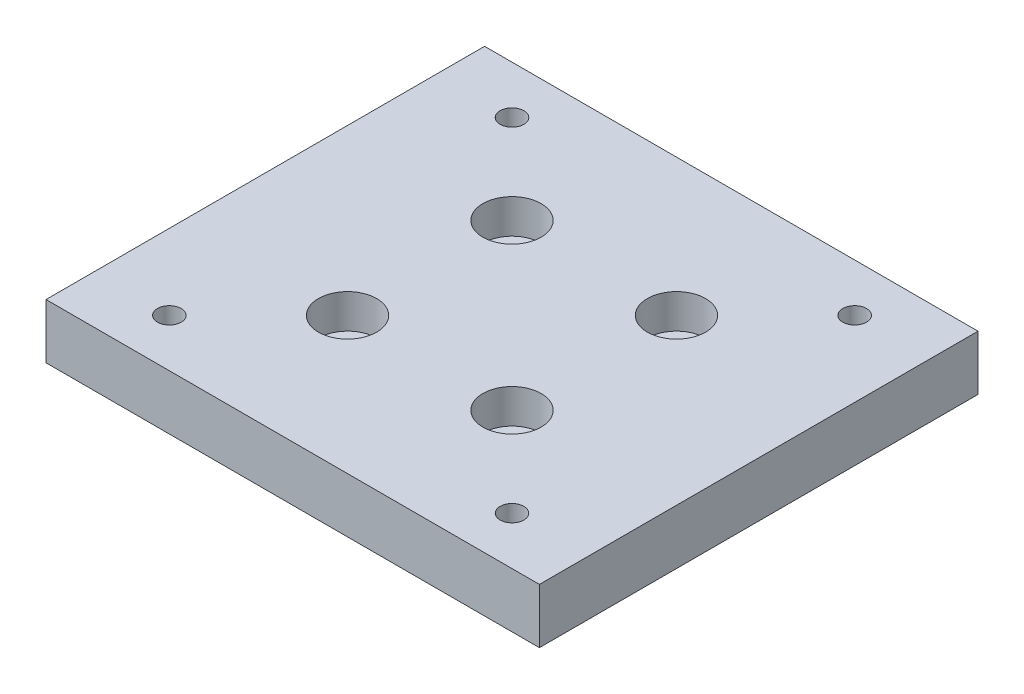
ISO-10303-21;
HEADER;
FILE_DESCRIPTION(('STEP AP214'),'2;1');
FILE_NAME('part.step','',(''),(''),'','','');
FILE_SCHEMA(('AUTOMOTIVE_DESIGN { 1 0 10303 214 1 1 1 1 }'));
ENDSEC;
DATA;
#1=APPLICATION_CONTEXT('core data for automotive mechanical design processes');
#2=APPLICATION_PROTOCOL_DEFINITION('international standard','automotive_design',2000,#1);
#3=PRODUCT_CONTEXT('',#1,'mechanical');
#4=PRODUCT('Part','Part','',(#3));
#5=PRODUCT_RELATED_PRODUCT_CATEGORY('part','',(#4));
#6=PRODUCT_DEFINITION_FORMATION('','',#4);
#7=PRODUCT_DEFINITION_CONTEXT('part definition',#1,'design');
#8=PRODUCT_DEFINITION('design','',#6,#7);
#9=PRODUCT_DEFINITION_SHAPE('','',#8);
#10=(LENGTH_UNIT() NAMED_UNIT(*) SI_UNIT(.MILLI.,.METRE.));
#11=(NAMED_UNIT(*) PLANE_ANGLE_UNIT() SI_UNIT($,.RADIAN.));
#12=(NAMED_UNIT(*) SI_UNIT($,.STERADIAN.) SOLID_ANGLE_UNIT());
#13=UNCERTAINTY_MEASURE_WITH_UNIT(LENGTH_MEASURE(1.E-05),#10,'distance_accuracy_value','');
#14=(GEOMETRIC_REPRESENTATION_CONTEXT(3) GLOBAL_UNCERTAINTY_ASSIGNED_CONTEXT((#13)) GLOBAL_UNIT_ASSIGNED_CONTEXT((#10,
#11,#12)) REPRESENTATION_CONTEXT('',''));
#15=CARTESIAN_POINT('',(0.,0.,0.));
#16=DIRECTION('',(0.,0.,1.));
#17=DIRECTION('',(1.,0.,0.));
#18=AXIS2_PLACEMENT_3D('',#15,#16,#17);
#19=CARTESIAN_POINT('',(0.,12.7,0.));
#20=DIRECTION('',(0.,-1.,0.));
#21=DIRECTION('',(0.,0.,-1.));
#22=AXIS2_PLACEMENT_3D('',#19,#20,#21);
#23=PLANE('',#22);
#24=CARTESIAN_POINT('',(17.4625,12.7,-11.1125));
#25=DIRECTION('',(0.,1.,0.));
#26=DIRECTION('',(0.,0.,1.));
#27=AXIS2_PLACEMENT_3D('',#24,#25,#26);
#28=CIRCLE('',#27,2.75);
#29=CARTESIAN_POINT('',(17.4625,12.7,-8.3625));
#30=VERTEX_POINT('',#29);
#31=EDGE_CURVE('E180',#30,#30,#28,.T.);
#32=ORIENTED_EDGE('',*,*,#31,.F.);
#33=EDGE_LOOP('',(#32));
#34=FACE_BOUND('',#33,.T.);
#35=CARTESIAN_POINT('',(96.8375,12.7,-90.4875));
#36=DIRECTION('',(0.,1.,0.));
#37=DIRECTION('',(0.,0.,1.));
#38=AXIS2_PLACEMENT_3D('',#35,#36,#37);
#39=CIRCLE('',#38,2.75);
#40=CARTESIAN_POINT('',(96.8375,12.7,-87.7375));
#41=VERTEX_POINT('',#40);
#42=EDGE_CURVE('E168',#41,#41,#39,.T.);
#43=ORIENTED_EDGE('',*,*,#42,.F.);
#44=EDGE_LOOP('',(#43));
#45=FACE_BOUND('',#44,.T.);
#46=CARTESIAN_POINT('',(17.4625,12.7,-90.4875));
#47=DIRECTION('',(0.,1.,0.));
#48=DIRECTION('',(0.,0.,1.));
#49=AXIS2_PLACEMENT_3D('',#46,#47,#48);
#50=CIRCLE('',#49,2.75);
#51=CARTESIAN_POINT('',(17.4625,12.7,-87.7375));
#52=VERTEX_POINT('',#51);
#53=EDGE_CURVE('E162',#52,#52,#50,.T.);
#54=ORIENTED_EDGE('',*,*,#53,.F.);
#55=EDGE_LOOP('',(#54));
#56=FACE_BOUND('',#55,.T.);
#57=CARTESIAN_POINT('',(38.1,12.7,-69.85));
#58=DIRECTION('',(0.,1.,0.));
#59=DIRECTION('',(0.,0.,1.));
#60=AXIS2_PLACEMENT_3D('',#57,#58,#59);
#61=CIRCLE('',#60,6.74751);
#62=CARTESIAN_POINT('',(38.1,12.7,-63.10249));
#63=VERTEX_POINT('',#62);
#64=EDGE_CURVE('E156',#63,#63,#61,.T.);
#65=ORIENTED_EDGE('',*,*,#64,.F.);
#66=EDGE_LOOP('',(#65));
#67=FACE_BOUND('',#66,.T.);
#68=CARTESIAN_POINT('',(76.2,12.7,-69.85));
#69=DIRECTION('',(0.,1.,0.));
#70=DIRECTION('',(0.,0.,1.));
#71=AXIS2_PLACEMENT_3D('',#68,#69,#70);
#72=CIRCLE('',#71,6.74751);
#73=CARTESIAN_POINT('',(76.2,12.7,-63.10249));
#74=VERTEX_POINT('',#73);
#75=EDGE_CURVE('E144',#74,#74,#72,.T.);
#76=ORIENTED_EDGE('',*,*,#75,.F.);
#77=EDGE_LOOP('',(#76));
#78=FACE_BOUND('',#77,.T.);
#79=CARTESIAN_POINT('',(76.2,12.7,-31.75));
#80=DIRECTION('',(0.,1.,0.));
#81=DIRECTION('',(0.,0.,1.));
#82=AXIS2_PLACEMENT_3D('',#79,#80,#81);
#83=CIRCLE('',#82,6.74751);
#84=CARTESIAN_POINT('',(76.2,12.7,-25.00249));
#85=VERTEX_POINT('',#84);
#86=EDGE_CURVE('E132',#85,#85,#83,.T.);
#87=ORIENTED_EDGE('',*,*,#86,.F.);
#88=EDGE_LOOP('',(#87));
#89=FACE_BOUND('',#88,.T.);
#90=CARTESIAN_POINT('',(38.1,12.7,-31.75));
#91=DIRECTION('',(0.,1.,0.));
#92=DIRECTION('',(0.,0.,1.));
#93=AXIS2_PLACEMENT_3D('',#90,#91,#92);
#94=CIRCLE('',#93,6.74751);
#95=CARTESIAN_POINT('',(38.1,12.7,-25.00249));
#96=VERTEX_POINT('',#95);
#97=EDGE_CURVE('E120',#96,#96,#94,.T.);
#98=ORIENTED_EDGE('',*,*,#97,.F.);
#99=EDGE_LOOP('',(#98));
#100=FACE_BOUND('',#99,.T.);
#101=DIRECTION('',(0.,0.,1.));
#102=VECTOR('',#101,1.);
#103=CARTESIAN_POINT('',(0.,12.7,0.));
#104=LINE('',#103,#102);
#105=CARTESIAN_POINT('',(0.,12.7,-101.6));
#106=VERTEX_POINT('',#105);
#107=CARTESIAN_POINT('',(0.,12.7,0.));
#108=VERTEX_POINT('',#107);
#109=EDGE_CURVE('E85',#106,#108,#104,.T.);
#110=ORIENTED_EDGE('',*,*,#109,.T.);
#111=DIRECTION('',(1.,0.,0.));
#112=VECTOR('',#111,1.);
#113=CARTESIAN_POINT('',(0.,12.7,0.));
#114=LINE('',#113,#112);
#115=CARTESIAN_POINT('',(114.3,12.7,0.));
#116=VERTEX_POINT('',#115);
#117=EDGE_CURVE('E80',#108,#116,#114,.T.);
#118=ORIENTED_EDGE('',*,*,#117,.T.);
#119=DIRECTION('',(0.,0.,-1.));
#120=VECTOR('',#119,1.);
#121=CARTESIAN_POINT('',(114.3,12.7,0.));
#122=LINE('',#121,#120);
#123=CARTESIAN_POINT('',(114.3,12.7,-101.6));
#124=VERTEX_POINT('',#123);
#125=EDGE_CURVE('E83',#116,#124,#122,.T.);
#126=ORIENTED_EDGE('',*,*,#125,.T.);
#127=DIRECTION('',(-1.,0.,0.));
#128=VECTOR('',#127,1.);
#129=CARTESIAN_POINT('',(0.,12.7,-101.6));
#130=LINE('',#129,#128);
#131=EDGE_CURVE('E50',#124,#106,#130,.T.);
#132=ORIENTED_EDGE('',*,*,#131,.T.);
#133=EDGE_LOOP('',(#110,#118,#126,#132));
#134=FACE_BOUND('',#133,.T.);
#135=CARTESIAN_POINT('',(96.8375,12.7,-11.1125));
#136=DIRECTION('',(0.,1.,0.));
#137=DIRECTION('',(0.,0.,1.));
#138=AXIS2_PLACEMENT_3D('',#135,#136,#137);
#139=CIRCLE('',#138,2.75);
#140=CARTESIAN_POINT('',(96.8375,12.7,-8.3625));
#141=VERTEX_POINT('',#140);
#142=EDGE_CURVE('E174',#141,#141,#139,.T.);
#143=ORIENTED_EDGE('',*,*,#142,.F.);
#144=EDGE_LOOP('',(#143));
#145=FACE_BOUND('',#144,.T.);
#146=ADVANCED_FACE('F33',(#34,#45,#56,#67,#78,#89,#100,#134,#145),#23,.F.);
#147=CARTESIAN_POINT('',(0.,0.,0.));
#148=DIRECTION('',(0.,-1.,0.));
#149=DIRECTION('',(0.,0.,-1.));
#150=AXIS2_PLACEMENT_3D('',#147,#148,#149);
#151=PLANE('',#150);
#152=CARTESIAN_POINT('',(17.4625,0.,-11.1125));
#153=DIRECTION('',(0.,1.,0.));
#154=DIRECTION('',(0.,0.,1.));
#155=AXIS2_PLACEMENT_3D('',#152,#153,#154);
#156=CIRCLE('',#155,2.75);
#157=CARTESIAN_POINT('',(17.4625,0.,-8.3625));
#158=VERTEX_POINT('',#157);
#159=EDGE_CURVE('E177',#158,#158,#156,.T.);
#160=ORIENTED_EDGE('',*,*,#159,.T.);
#161=EDGE_LOOP('',(#160));
#162=FACE_BOUND('',#161,.T.);
#163=CARTESIAN_POINT('',(96.8375,0.,-11.1125));
#164=DIRECTION('',(0.,1.,0.));
#165=DIRECTION('',(0.,0.,1.));
#166=AXIS2_PLACEMENT_3D('',#163,#164,#165);
#167=CIRCLE('',#166,2.74999999999999);
#168=CARTESIAN_POINT('',(96.8375,0.,-8.36250000000001));
#169=VERTEX_POINT('',#168);
#170=EDGE_CURVE('E171',#169,#169,#167,.T.);
#171=ORIENTED_EDGE('',*,*,#170,.T.);
#172=EDGE_LOOP('',(#171));
#173=FACE_BOUND('',#172,.T.);
#174=CARTESIAN_POINT('',(96.8375,0.,-90.4875));
#175=DIRECTION('',(0.,1.,0.));
#176=DIRECTION('',(0.,0.,1.));
#177=AXIS2_PLACEMENT_3D('',#174,#175,#176);
#178=CIRCLE('',#177,2.74999999999999);
#179=CARTESIAN_POINT('',(96.8375,0.,-87.7375));
#180=VERTEX_POINT('',#179);
#181=EDGE_CURVE('E165',#180,#180,#178,.T.);
#182=ORIENTED_EDGE('',*,*,#181,.T.);
#183=EDGE_LOOP('',(#182));
#184=FACE_BOUND('',#183,.T.);
#185=CARTESIAN_POINT('',(17.4625,0.,-90.4875));
#186=DIRECTION('',(0.,1.,0.));
#187=DIRECTION('',(0.,0.,1.));
#188=AXIS2_PLACEMENT_3D('',#185,#186,#187);
#189=CIRCLE('',#188,2.75);
#190=CARTESIAN_POINT('',(17.4625,0.,-87.7375));
#191=VERTEX_POINT('',#190);
#192=EDGE_CURVE('E159',#191,#191,#189,.T.);
#193=ORIENTED_EDGE('',*,*,#192,.T.);
#194=EDGE_LOOP('',(#193));
#195=FACE_BOUND('',#194,.T.);
#196=CARTESIAN_POINT('',(38.1,0.,-69.85));
#197=DIRECTION('',(0.,1.,0.));
#198=DIRECTION('',(0.,0.,1.));
#199=AXIS2_PLACEMENT_3D('',#196,#197,#198);
#200=CIRCLE('',#199,4.21639999999999);
#201=CARTESIAN_POINT('',(38.1,0.,-65.6336));
#202=VERTEX_POINT('',#201);
#203=EDGE_CURVE('E147',#202,#202,#200,.T.);
#204=ORIENTED_EDGE('',*,*,#203,.T.);
#205=EDGE_LOOP('',(#204));
#206=FACE_BOUND('',#205,.T.);
#207=DIRECTION('',(0.,0.,1.));
#208=VECTOR('',#207,1.);
#209=CARTESIAN_POINT('',(0.,0.,0.));
#210=LINE('',#209,#208);
#211=CARTESIAN_POINT('',(0.,0.,-101.6));
#212=VERTEX_POINT('',#211);
#213=CARTESIAN_POINT('',(0.,0.,0.));
#214=VERTEX_POINT('',#213);
#215=EDGE_CURVE('E97',#212,#214,#210,.T.);
#216=ORIENTED_EDGE('',*,*,#215,.F.);
#217=DIRECTION('',(-1.,0.,0.));
#218=VECTOR('',#217,1.);
#219=CARTESIAN_POINT('',(0.,0.,-101.6));
#220=LINE('',#219,#218);
#221=CARTESIAN_POINT('',(114.3,0.,-101.6));
#222=VERTEX_POINT('',#221);
#223=EDGE_CURVE('E73',#222,#212,#220,.T.);
#224=ORIENTED_EDGE('',*,*,#223,.F.);
#225=DIRECTION('',(0.,0.,-1.));
#226=VECTOR('',#225,1.);
#227=CARTESIAN_POINT('',(114.3,0.,0.));
#228=LINE('',#227,#226);
#229=CARTESIAN_POINT('',(114.3,0.,0.));
#230=VERTEX_POINT('',#229);
#231=EDGE_CURVE('E67',#230,#222,#228,.T.);
#232=ORIENTED_EDGE('',*,*,#231,.F.);
#233=DIRECTION('',(1.,0.,0.));
#234=VECTOR('',#233,1.);
#235=CARTESIAN_POINT('',(0.,0.,0.));
#236=LINE('',#235,#234);
#237=EDGE_CURVE('E89',#214,#230,#236,.T.);
#238=ORIENTED_EDGE('',*,*,#237,.F.);
#239=EDGE_LOOP('',(#216,#224,#232,#238));
#240=FACE_BOUND('',#239,.T.);
#241=CARTESIAN_POINT('',(38.1,0.,-31.75));
#242=DIRECTION('',(0.,1.,0.));
#243=DIRECTION('',(0.,0.,1.));
#244=AXIS2_PLACEMENT_3D('',#241,#242,#243);
#245=CIRCLE('',#244,4.21639999999999);
#246=CARTESIAN_POINT('',(38.1,0.,-27.5336));
#247=VERTEX_POINT('',#246);
#248=EDGE_CURVE('E100',#247,#247,#245,.T.);
#249=ORIENTED_EDGE('',*,*,#248,.T.);
#250=EDGE_LOOP('',(#249));
#251=FACE_BOUND('',#250,.T.);
#252=CARTESIAN_POINT('',(76.2,0.,-31.75));
#253=DIRECTION('',(0.,1.,0.));
#254=DIRECTION('',(0.,0.,1.));
#255=AXIS2_PLACEMENT_3D('',#252,#253,#254);
#256=CIRCLE('',#255,4.21639999999999);
#257=CARTESIAN_POINT('',(76.2,0.,-27.5336));
#258=VERTEX_POINT('',#257);
#259=EDGE_CURVE('E123',#258,#258,#256,.T.);
#260=ORIENTED_EDGE('',*,*,#259,.T.);
#261=EDGE_LOOP('',(#260));
#262=FACE_BOUND('',#261,.T.);
#263=CARTESIAN_POINT('',(76.2,0.,-69.85));
#264=DIRECTION('',(0.,1.,0.));
#265=DIRECTION('',(0.,0.,1.));
#266=AXIS2_PLACEMENT_3D('',#263,#264,#265);
#267=CIRCLE('',#266,4.21639999999999);
#268=CARTESIAN_POINT('',(76.2,0.,-65.6336));
#269=VERTEX_POINT('',#268);
#270=EDGE_CURVE('E135',#269,#269,#267,.T.);
#271=ORIENTED_EDGE('',*,*,#270,.T.);
#272=EDGE_LOOP('',(#271));
#273=FACE_BOUND('',#272,.T.);
#274=ADVANCED_FACE('F108',(#162,#173,#184,#195,#206,#240,#251,#262,#273),#151,.T.);
#275=CARTESIAN_POINT('',(0.,12.7,0.));
#276=DIRECTION('',(1.,0.,0.));
#277=DIRECTION('',(0.,0.,-1.));
#278=AXIS2_PLACEMENT_3D('',#275,#276,#277);
#279=PLANE('',#278);
#280=ORIENTED_EDGE('',*,*,#215,.T.);
#281=DIRECTION('',(0.,-1.,0.));
#282=VECTOR('',#281,1.);
#283=CARTESIAN_POINT('',(0.,12.7,0.));
#284=LINE('',#283,#282);
#285=EDGE_CURVE('E11',#108,#214,#284,.T.);
#286=ORIENTED_EDGE('',*,*,#285,.F.);
#287=ORIENTED_EDGE('',*,*,#109,.F.);
#288=DIRECTION('',(0.,-1.,0.));
#289=VECTOR('',#288,1.);
#290=CARTESIAN_POINT('',(0.,12.7,-101.6));
#291=LINE('',#290,#289);
#292=EDGE_CURVE('E93',#106,#212,#291,.T.);
#293=ORIENTED_EDGE('',*,*,#292,.T.);
#294=EDGE_LOOP('',(#280,#286,#287,#293));
#295=FACE_BOUND('',#294,.T.);
#296=ADVANCED_FACE('F35',(#295),#279,.F.);
#297=CARTESIAN_POINT('',(0.,12.7,0.));
#298=DIRECTION('',(0.,0.,-1.));
#299=DIRECTION('',(-1.,0.,0.));
#300=AXIS2_PLACEMENT_3D('',#297,#298,#299);
#301=PLANE('',#300);
#302=ORIENTED_EDGE('',*,*,#237,.T.);
#303=DIRECTION('',(0.,-1.,0.));
#304=VECTOR('',#303,1.);
#305=CARTESIAN_POINT('',(114.3,12.7,0.));
#306=LINE('',#305,#304);
#307=EDGE_CURVE('E42',#116,#230,#306,.T.);
#308=ORIENTED_EDGE('',*,*,#307,.F.);
#309=ORIENTED_EDGE('',*,*,#117,.F.);
#310=ORIENTED_EDGE('',*,*,#285,.T.);
#311=EDGE_LOOP('',(#302,#308,#309,#310));
#312=FACE_BOUND('',#311,.T.);
#313=ADVANCED_FACE('F88',(#312),#301,.F.);
#314=CARTESIAN_POINT('',(114.3,12.7,0.));
#315=DIRECTION('',(-1.,0.,0.));
#316=DIRECTION('',(0.,0.,1.));
#317=AXIS2_PLACEMENT_3D('',#314,#315,#316);
#318=PLANE('',#317);
#319=ORIENTED_EDGE('',*,*,#231,.T.);
#320=DIRECTION('',(0.,-1.,0.));
#321=VECTOR('',#320,1.);
#322=CARTESIAN_POINT('',(114.3,12.7,-101.6));
#323=LINE('',#322,#321);
#324=EDGE_CURVE('E90',#124,#222,#323,.T.);
#325=ORIENTED_EDGE('',*,*,#324,.F.);
#326=ORIENTED_EDGE('',*,*,#125,.F.);
#327=ORIENTED_EDGE('',*,*,#307,.T.);
#328=EDGE_LOOP('',(#319,#325,#326,#327));
#329=FACE_BOUND('',#328,.T.);
#330=ADVANCED_FACE('F91',(#329),#318,.F.);
#331=CARTESIAN_POINT('',(0.,12.7,-101.6));
#332=DIRECTION('',(0.,0.,1.));
#333=DIRECTION('',(1.,0.,0.));
#334=AXIS2_PLACEMENT_3D('',#331,#332,#333);
#335=PLANE('',#334);
#336=ORIENTED_EDGE('',*,*,#223,.T.);
#337=ORIENTED_EDGE('',*,*,#292,.F.);
#338=ORIENTED_EDGE('',*,*,#131,.F.);
#339=ORIENTED_EDGE('',*,*,#324,.T.);
#340=EDGE_LOOP('',(#336,#337,#338,#339));
#341=FACE_BOUND('',#340,.T.);
#342=ADVANCED_FACE('F105',(#341),#335,.F.);
#343=CARTESIAN_POINT('',(38.1,12.7,-31.75));
#344=DIRECTION('',(0.,1.,0.));
#345=DIRECTION('',(0.,0.,1.));
#346=AXIS2_PLACEMENT_3D('',#343,#344,#345);
#347=CYLINDRICAL_SURFACE('',#346,4.2164);
#348=ORIENTED_EDGE('',*,*,#248,.F.);
#349=EDGE_LOOP('',(#348));
#350=FACE_BOUND('',#349,.T.);
#351=CARTESIAN_POINT('',(38.1,4.7625,-31.75));
#352=DIRECTION('',(0.,1.,0.));
#353=DIRECTION('',(0.,0.,1.));
#354=AXIS2_PLACEMENT_3D('',#351,#352,#353);
#355=CIRCLE('',#354,4.2164);
#356=CARTESIAN_POINT('',(38.1,4.7625,-27.5336));
#357=VERTEX_POINT('',#356);
#358=EDGE_CURVE('E114',#357,#357,#355,.T.);
#359=ORIENTED_EDGE('',*,*,#358,.T.);
#360=EDGE_LOOP('',(#359));
#361=FACE_BOUND('',#360,.T.);
#362=ADVANCED_FACE('F214',(#350,#361),#347,.F.);
#363=CARTESIAN_POINT('',(42.3164,4.7625,-31.75));
#364=DIRECTION('',(0.,-1.,0.));
#365=DIRECTION('',(0.,0.,-1.));
#366=AXIS2_PLACEMENT_3D('',#363,#364,#365);
#367=PLANE('',#366);
#368=ORIENTED_EDGE('',*,*,#358,.F.);
#369=EDGE_LOOP('',(#368));
#370=FACE_BOUND('',#369,.T.);
#371=CARTESIAN_POINT('',(38.1,4.7625,-31.75));
#372=DIRECTION('',(0.,1.,0.));
#373=DIRECTION('',(0.,0.,1.));
#374=AXIS2_PLACEMENT_3D('',#371,#372,#373);
#375=CIRCLE('',#374,6.74751);
#376=CARTESIAN_POINT('',(38.1,4.7625,-25.00249));
#377=VERTEX_POINT('',#376);
#378=EDGE_CURVE('E117',#377,#377,#375,.T.);
#379=ORIENTED_EDGE('',*,*,#378,.T.);
#380=EDGE_LOOP('',(#379));
#381=FACE_BOUND('',#380,.T.);
#382=ADVANCED_FACE('F204',(#370,#381),#367,.F.);
#383=CARTESIAN_POINT('',(38.1,12.7,-31.75));
#384=DIRECTION('',(0.,1.,0.));
#385=DIRECTION('',(0.,0.,1.));
#386=AXIS2_PLACEMENT_3D('',#383,#384,#385);
#387=CYLINDRICAL_SURFACE('',#386,6.74751);
#388=ORIENTED_EDGE('',*,*,#378,.F.);
#389=EDGE_LOOP('',(#388));
#390=FACE_BOUND('',#389,.T.);
#391=ORIENTED_EDGE('',*,*,#97,.T.);
#392=EDGE_LOOP('',(#391));
#393=FACE_BOUND('',#392,.T.);
#394=ADVANCED_FACE('F201',(#390,#393),#387,.F.);
#395=CARTESIAN_POINT('',(76.2,12.7,-31.75));
#396=DIRECTION('',(0.,1.,0.));
#397=DIRECTION('',(0.,0.,1.));
#398=AXIS2_PLACEMENT_3D('',#395,#396,#397);
#399=CYLINDRICAL_SURFACE('',#398,4.21639999999999);
#400=ORIENTED_EDGE('',*,*,#259,.F.);
#401=EDGE_LOOP('',(#400));
#402=FACE_BOUND('',#401,.T.);
#403=CARTESIAN_POINT('',(76.2,4.7625,-31.75));
#404=DIRECTION('',(0.,1.,0.));
#405=DIRECTION('',(0.,0.,1.));
#406=AXIS2_PLACEMENT_3D('',#403,#404,#405);
#407=CIRCLE('',#406,4.21639999999999);
#408=CARTESIAN_POINT('',(76.2,4.7625,-27.5336));
#409=VERTEX_POINT('',#408);
#410=EDGE_CURVE('E126',#409,#409,#407,.T.);
#411=ORIENTED_EDGE('',*,*,#410,.T.);
#412=EDGE_LOOP('',(#411));
#413=FACE_BOUND('',#412,.T.);
#414=ADVANCED_FACE('F203',(#402,#413),#399,.F.);
#415=CARTESIAN_POINT('',(80.4164,4.7625,-31.75));
#416=DIRECTION('',(0.,-1.,0.));
#417=DIRECTION('',(0.,0.,-1.));
#418=AXIS2_PLACEMENT_3D('',#415,#416,#417);
#419=PLANE('',#418);
#420=ORIENTED_EDGE('',*,*,#410,.F.);
#421=EDGE_LOOP('',(#420));
#422=FACE_BOUND('',#421,.T.);
#423=CARTESIAN_POINT('',(76.2,4.7625,-31.75));
#424=DIRECTION('',(0.,1.,0.));
#425=DIRECTION('',(0.,0.,1.));
#426=AXIS2_PLACEMENT_3D('',#423,#424,#425);
#427=CIRCLE('',#426,6.74751);
#428=CARTESIAN_POINT('',(76.2,4.7625,-25.00249));
#429=VERTEX_POINT('',#428);
#430=EDGE_CURVE('E129',#429,#429,#427,.T.);
#431=ORIENTED_EDGE('',*,*,#430,.T.);
#432=EDGE_LOOP('',(#431));
#433=FACE_BOUND('',#432,.T.);
#434=ADVANCED_FACE('F211',(#422,#433),#419,.F.);
#435=CARTESIAN_POINT('',(76.2,12.7,-31.75));
#436=DIRECTION('',(0.,1.,0.));
#437=DIRECTION('',(0.,0.,1.));
#438=AXIS2_PLACEMENT_3D('',#435,#436,#437);
#439=CYLINDRICAL_SURFACE('',#438,6.74751);
#440=ORIENTED_EDGE('',*,*,#430,.F.);
#441=EDGE_LOOP('',(#440));
#442=FACE_BOUND('',#441,.T.);
#443=ORIENTED_EDGE('',*,*,#86,.T.);
#444=EDGE_LOOP('',(#443));
#445=FACE_BOUND('',#444,.T.);
#446=ADVANCED_FACE('F307',(#442,#445),#439,.F.);
#447=CARTESIAN_POINT('',(76.2,12.7,-69.85));
#448=DIRECTION('',(0.,1.,0.));
#449=DIRECTION('',(0.,0.,1.));
#450=AXIS2_PLACEMENT_3D('',#447,#448,#449);
#451=CYLINDRICAL_SURFACE('',#450,4.21639999999999);
#452=ORIENTED_EDGE('',*,*,#270,.F.);
#453=EDGE_LOOP('',(#452));
#454=FACE_BOUND('',#453,.T.);
#455=CARTESIAN_POINT('',(76.2,4.7625,-69.85));
#456=DIRECTION('',(0.,1.,0.));
#457=DIRECTION('',(0.,0.,1.));
#458=AXIS2_PLACEMENT_3D('',#455,#456,#457);
#459=CIRCLE('',#458,4.21639999999999);
#460=CARTESIAN_POINT('',(76.2,4.7625,-65.6336));
#461=VERTEX_POINT('',#460);
#462=EDGE_CURVE('E138',#461,#461,#459,.T.);
#463=ORIENTED_EDGE('',*,*,#462,.T.);
#464=EDGE_LOOP('',(#463));
#465=FACE_BOUND('',#464,.T.);
#466=ADVANCED_FACE('F297',(#454,#465),#451,.F.);
#467=CARTESIAN_POINT('',(80.4164,4.7625,-69.85));
#468=DIRECTION('',(0.,-1.,0.));
#469=DIRECTION('',(0.,0.,-1.));
#470=AXIS2_PLACEMENT_3D('',#467,#468,#469);
#471=PLANE('',#470);
#472=ORIENTED_EDGE('',*,*,#462,.F.);
#473=EDGE_LOOP('',(#472));
#474=FACE_BOUND('',#473,.T.);
#475=CARTESIAN_POINT('',(76.2,4.7625,-69.85));
#476=DIRECTION('',(0.,1.,0.));
#477=DIRECTION('',(0.,0.,1.));
#478=AXIS2_PLACEMENT_3D('',#475,#476,#477);
#479=CIRCLE('',#478,6.74751);
#480=CARTESIAN_POINT('',(76.2,4.7625,-63.10249));
#481=VERTEX_POINT('',#480);
#482=EDGE_CURVE('E141',#481,#481,#479,.T.);
#483=ORIENTED_EDGE('',*,*,#482,.T.);
#484=EDGE_LOOP('',(#483));
#485=FACE_BOUND('',#484,.T.);
#486=ADVANCED_FACE('F287',(#474,#485),#471,.F.);
#487=CARTESIAN_POINT('',(76.2,12.7,-69.85));
#488=DIRECTION('',(0.,1.,0.));
#489=DIRECTION('',(0.,0.,1.));
#490=AXIS2_PLACEMENT_3D('',#487,#488,#489);
#491=CYLINDRICAL_SURFACE('',#490,6.74751);
#492=ORIENTED_EDGE('',*,*,#482,.F.);
#493=EDGE_LOOP('',(#492));
#494=FACE_BOUND('',#493,.T.);
#495=ORIENTED_EDGE('',*,*,#75,.T.);
#496=EDGE_LOOP('',(#495));
#497=FACE_BOUND('',#496,.T.);
#498=ADVANCED_FACE('F277',(#494,#497),#491,.F.);
#499=CARTESIAN_POINT('',(38.1,12.7,-69.85));
#500=DIRECTION('',(0.,1.,0.));
#501=DIRECTION('',(0.,0.,1.));
#502=AXIS2_PLACEMENT_3D('',#499,#500,#501);
#503=CYLINDRICAL_SURFACE('',#502,4.2164);
#504=ORIENTED_EDGE('',*,*,#203,.F.);
#505=EDGE_LOOP('',(#504));
#506=FACE_BOUND('',#505,.T.);
#507=CARTESIAN_POINT('',(38.1,4.7625,-69.85));
#508=DIRECTION('',(0.,1.,0.));
#509=DIRECTION('',(0.,0.,1.));
#510=AXIS2_PLACEMENT_3D('',#507,#508,#509);
#511=CIRCLE('',#510,4.2164);
#512=CARTESIAN_POINT('',(38.1,4.7625,-65.6336));
#513=VERTEX_POINT('',#512);
#514=EDGE_CURVE('E150',#513,#513,#511,.T.);
#515=ORIENTED_EDGE('',*,*,#514,.T.);
#516=EDGE_LOOP('',(#515));
#517=FACE_BOUND('',#516,.T.);
#518=ADVANCED_FACE('F267',(#506,#517),#503,.F.);
#519=CARTESIAN_POINT('',(42.3164,4.7625,-69.85));
#520=DIRECTION('',(0.,-1.,0.));
#521=DIRECTION('',(0.,0.,-1.));
#522=AXIS2_PLACEMENT_3D('',#519,#520,#521);
#523=PLANE('',#522);
#524=ORIENTED_EDGE('',*,*,#514,.F.);
#525=EDGE_LOOP('',(#524));
#526=FACE_BOUND('',#525,.T.);
#527=CARTESIAN_POINT('',(38.1,4.7625,-69.85));
#528=DIRECTION('',(0.,1.,0.));
#529=DIRECTION('',(0.,0.,1.));
#530=AXIS2_PLACEMENT_3D('',#527,#528,#529);
#531=CIRCLE('',#530,6.74751);
#532=CARTESIAN_POINT('',(38.1,4.7625,-63.10249));
#533=VERTEX_POINT('',#532);
#534=EDGE_CURVE('E153',#533,#533,#531,.T.);
#535=ORIENTED_EDGE('',*,*,#534,.T.);
#536=EDGE_LOOP('',(#535));
#537=FACE_BOUND('',#536,.T.);
#538=ADVANCED_FACE('F256',(#526,#537),#523,.F.);
#539=CARTESIAN_POINT('',(38.1,12.7,-69.85));
#540=DIRECTION('',(0.,1.,0.));
#541=DIRECTION('',(0.,0.,1.));
#542=AXIS2_PLACEMENT_3D('',#539,#540,#541);
#543=CYLINDRICAL_SURFACE('',#542,6.74751);
#544=ORIENTED_EDGE('',*,*,#534,.F.);
#545=EDGE_LOOP('',(#544));
#546=FACE_BOUND('',#545,.T.);
#547=ORIENTED_EDGE('',*,*,#64,.T.);
#548=EDGE_LOOP('',(#547));
#549=FACE_BOUND('',#548,.T.);
#550=ADVANCED_FACE('F251',(#546,#549),#543,.F.);
#551=CARTESIAN_POINT('',(17.4625,12.7,-90.4875));
#552=DIRECTION('',(0.,1.,0.));
#553=DIRECTION('',(0.,0.,1.));
#554=AXIS2_PLACEMENT_3D('',#551,#552,#553);
#555=CYLINDRICAL_SURFACE('',#554,2.75);
#556=ORIENTED_EDGE('',*,*,#192,.F.);
#557=EDGE_LOOP('',(#556));
#558=FACE_BOUND('',#557,.T.);
#559=ORIENTED_EDGE('',*,*,#53,.T.);
#560=EDGE_LOOP('',(#559));
#561=FACE_BOUND('',#560,.T.);
#562=ADVANCED_FACE('F255',(#558,#561),#555,.F.);
#563=CARTESIAN_POINT('',(96.8375,12.7,-90.4875));
#564=DIRECTION('',(0.,1.,0.));
#565=DIRECTION('',(0.,0.,1.));
#566=AXIS2_PLACEMENT_3D('',#563,#564,#565);
#567=CYLINDRICAL_SURFACE('',#566,2.75);
#568=ORIENTED_EDGE('',*,*,#181,.F.);
#569=EDGE_LOOP('',(#568));
#570=FACE_BOUND('',#569,.T.);
#571=ORIENTED_EDGE('',*,*,#42,.T.);
#572=EDGE_LOOP('',(#571));
#573=FACE_BOUND('',#572,.T.);
#574=ADVANCED_FACE('F375',(#570,#573),#567,.F.);
#575=CARTESIAN_POINT('',(96.8375,12.7,-11.1125));
#576=DIRECTION('',(0.,1.,0.));
#577=DIRECTION('',(0.,0.,1.));
#578=AXIS2_PLACEMENT_3D('',#575,#576,#577);
#579=CYLINDRICAL_SURFACE('',#578,2.75);
#580=ORIENTED_EDGE('',*,*,#170,.F.);
#581=EDGE_LOOP('',(#580));
#582=FACE_BOUND('',#581,.T.);
#583=ORIENTED_EDGE('',*,*,#142,.T.);
#584=EDGE_LOOP('',(#583));
#585=FACE_BOUND('',#584,.T.);
#586=ADVANCED_FACE('F379',(#582,#585),#579,.F.);
#587=CARTESIAN_POINT('',(17.4625,12.7,-11.1125));
#588=DIRECTION('',(0.,1.,0.));
#589=DIRECTION('',(0.,0.,1.));
#590=AXIS2_PLACEMENT_3D('',#587,#588,#589);
#591=CYLINDRICAL_SURFACE('',#590,2.75);
#592=ORIENTED_EDGE('',*,*,#159,.F.);
#593=EDGE_LOOP('',(#592));
#594=FACE_BOUND('',#593,.T.);
#595=ORIENTED_EDGE('',*,*,#31,.T.);
#596=EDGE_LOOP('',(#595));
#597=FACE_BOUND('',#596,.T.);
#598=ADVANCED_FACE('F184',(#594,#597),#591,.F.);
#599=CLOSED_SHELL('',(#146,#274,#296,#313,#330,#342,#362,#382,#394,#414,#434,#446,#466,#486,
#498,#518,#538,#550,#562,#574,#586,#598));
#600=MANIFOLD_SOLID_BREP('B2',#599);
#601=ADVANCED_BREP_SHAPE_REPRESENTATION('',(#18,#600),#14);
#602=SHAPE_DEFINITION_REPRESENTATION(#9,#601);
ENDSEC;
END-ISO-10303-21;
